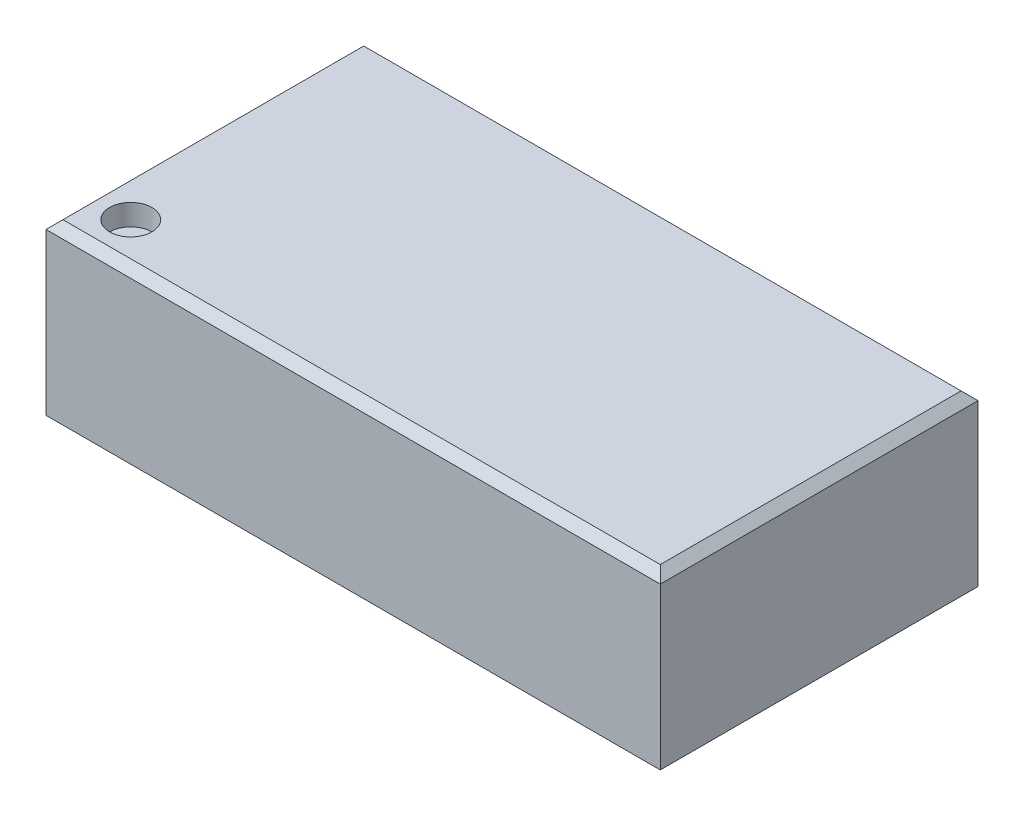
ISO-10303-21;
HEADER;
FILE_DESCRIPTION(('STEP AP214'),'2;1');
FILE_NAME('part.step','',(''),(''),'','','');
FILE_SCHEMA(('AUTOMOTIVE_DESIGN { 1 0 10303 214 1 1 1 1 }'));
ENDSEC;
DATA;
#1=APPLICATION_CONTEXT('core data for automotive mechanical design processes');
#2=APPLICATION_PROTOCOL_DEFINITION('international standard','automotive_design',2000,#1);
#3=PRODUCT_CONTEXT('',#1,'mechanical');
#4=PRODUCT('Part','Part','',(#3));
#5=PRODUCT_RELATED_PRODUCT_CATEGORY('part','',(#4));
#6=PRODUCT_DEFINITION_FORMATION('','',#4);
#7=PRODUCT_DEFINITION_CONTEXT('part definition',#1,'design');
#8=PRODUCT_DEFINITION('design','',#6,#7);
#9=PRODUCT_DEFINITION_SHAPE('','',#8);
#10=(LENGTH_UNIT() NAMED_UNIT(*) SI_UNIT(.MILLI.,.METRE.));
#11=(NAMED_UNIT(*) PLANE_ANGLE_UNIT() SI_UNIT($,.RADIAN.));
#12=(NAMED_UNIT(*) SI_UNIT($,.STERADIAN.) SOLID_ANGLE_UNIT());
#13=UNCERTAINTY_MEASURE_WITH_UNIT(LENGTH_MEASURE(1.E-05),#10,'distance_accuracy_value','');
#14=(GEOMETRIC_REPRESENTATION_CONTEXT(3) GLOBAL_UNCERTAINTY_ASSIGNED_CONTEXT((#13)) GLOBAL_UNIT_ASSIGNED_CONTEXT((#10,
#11,#12)) REPRESENTATION_CONTEXT('',''));
#15=CARTESIAN_POINT('',(0.,0.,0.));
#16=DIRECTION('',(0.,0.,1.));
#17=DIRECTION('',(1.,0.,0.));
#18=AXIS2_PLACEMENT_3D('',#15,#16,#17);
#19=CARTESIAN_POINT('',(-3.625,2.,-1.875));
#20=DIRECTION('',(1.,0.,0.));
#21=DIRECTION('',(0.,0.,-1.));
#22=AXIS2_PLACEMENT_3D('',#19,#20,#21);
#23=PLANE('',#22);
#24=DIRECTION('',(0.,-1.,0.));
#25=VECTOR('',#24,1.);
#26=CARTESIAN_POINT('',(-3.625,2.,1.875));
#27=LINE('',#26,#25);
#28=CARTESIAN_POINT('',(-3.625,1.9,1.875));
#29=VERTEX_POINT('',#28);
#30=CARTESIAN_POINT('',(-3.625,0.,1.875));
#31=VERTEX_POINT('',#30);
#32=EDGE_CURVE('E86',#29,#31,#27,.T.);
#33=ORIENTED_EDGE('',*,*,#32,.F.);
#34=DIRECTION('',(0.,0.,-1.));
#35=VECTOR('',#34,1.);
#36=CARTESIAN_POINT('',(-3.625,1.9,-1.875));
#37=LINE('',#36,#35);
#38=CARTESIAN_POINT('',(-3.625,1.9,-1.875));
#39=VERTEX_POINT('',#38);
#40=EDGE_CURVE('E11',#29,#39,#37,.T.);
#41=ORIENTED_EDGE('',*,*,#40,.T.);
#42=DIRECTION('',(0.,-1.,0.));
#43=VECTOR('',#42,1.);
#44=CARTESIAN_POINT('',(-3.625,2.,-1.875));
#45=LINE('',#44,#43);
#46=CARTESIAN_POINT('',(-3.625,0.,-1.875));
#47=VERTEX_POINT('',#46);
#48=EDGE_CURVE('E103',#39,#47,#45,.T.);
#49=ORIENTED_EDGE('',*,*,#48,.T.);
#50=DIRECTION('',(0.,0.,1.));
#51=VECTOR('',#50,1.);
#52=CARTESIAN_POINT('',(-3.625,0.,-1.875));
#53=LINE('',#52,#51);
#54=EDGE_CURVE('E99',#47,#31,#53,.T.);
#55=ORIENTED_EDGE('',*,*,#54,.T.);
#56=EDGE_LOOP('',(#33,#41,#49,#55));
#57=FACE_BOUND('',#56,.T.);
#58=ADVANCED_FACE('F34',(#57),#23,.F.);
#59=CARTESIAN_POINT('',(-3.625,2.,1.875));
#60=DIRECTION('',(0.,0.,-1.));
#61=DIRECTION('',(-1.,0.,0.));
#62=AXIS2_PLACEMENT_3D('',#59,#60,#61);
#63=PLANE('',#62);
#64=DIRECTION('',(0.,-1.,0.));
#65=VECTOR('',#64,1.);
#66=CARTESIAN_POINT('',(3.625,2.,1.875));
#67=LINE('',#66,#65);
#68=CARTESIAN_POINT('',(3.625,1.9,1.875));
#69=VERTEX_POINT('',#68);
#70=CARTESIAN_POINT('',(3.625,0.,1.875));
#71=VERTEX_POINT('',#70);
#72=EDGE_CURVE('E93',#69,#71,#67,.T.);
#73=ORIENTED_EDGE('',*,*,#72,.F.);
#74=DIRECTION('',(-1.,0.,0.));
#75=VECTOR('',#74,1.);
#76=CARTESIAN_POINT('',(-3.625,1.9,1.875));
#77=LINE('',#76,#75);
#78=EDGE_CURVE('E57',#69,#29,#77,.T.);
#79=ORIENTED_EDGE('',*,*,#78,.T.);
#80=ORIENTED_EDGE('',*,*,#32,.T.);
#81=DIRECTION('',(1.,0.,0.));
#82=VECTOR('',#81,1.);
#83=CARTESIAN_POINT('',(-3.625,0.,1.875));
#84=LINE('',#83,#82);
#85=EDGE_CURVE('E89',#31,#71,#84,.T.);
#86=ORIENTED_EDGE('',*,*,#85,.T.);
#87=EDGE_LOOP('',(#73,#79,#80,#86));
#88=FACE_BOUND('',#87,.T.);
#89=ADVANCED_FACE('F88',(#88),#63,.F.);
#90=CARTESIAN_POINT('',(3.625,2.,-1.875));
#91=DIRECTION('',(-1.,0.,0.));
#92=DIRECTION('',(0.,0.,1.));
#93=AXIS2_PLACEMENT_3D('',#90,#91,#92);
#94=PLANE('',#93);
#95=DIRECTION('',(0.,-1.,0.));
#96=VECTOR('',#95,1.);
#97=CARTESIAN_POINT('',(3.625,2.,-1.875));
#98=LINE('',#97,#96);
#99=CARTESIAN_POINT('',(3.625,1.9,-1.875));
#100=VERTEX_POINT('',#99);
#101=CARTESIAN_POINT('',(3.625,0.,-1.875));
#102=VERTEX_POINT('',#101);
#103=EDGE_CURVE('E116',#100,#102,#98,.T.);
#104=ORIENTED_EDGE('',*,*,#103,.F.);
#105=DIRECTION('',(0.,0.,1.));
#106=VECTOR('',#105,1.);
#107=CARTESIAN_POINT('',(3.625,1.9,1.875));
#108=LINE('',#107,#106);
#109=EDGE_CURVE('E127',#100,#69,#108,.T.);
#110=ORIENTED_EDGE('',*,*,#109,.T.);
#111=ORIENTED_EDGE('',*,*,#72,.T.);
#112=DIRECTION('',(0.,0.,-1.));
#113=VECTOR('',#112,1.);
#114=CARTESIAN_POINT('',(3.625,0.,-1.875));
#115=LINE('',#114,#113);
#116=EDGE_CURVE('E101',#71,#102,#115,.T.);
#117=ORIENTED_EDGE('',*,*,#116,.T.);
#118=EDGE_LOOP('',(#104,#110,#111,#117));
#119=FACE_BOUND('',#118,.T.);
#120=ADVANCED_FACE('F160',(#119),#94,.F.);
#121=CARTESIAN_POINT('',(-3.625,2.,-1.875));
#122=DIRECTION('',(0.,0.,1.));
#123=DIRECTION('',(1.,0.,0.));
#124=AXIS2_PLACEMENT_3D('',#121,#122,#123);
#125=PLANE('',#124);
#126=ORIENTED_EDGE('',*,*,#48,.F.);
#127=DIRECTION('',(1.,0.,0.));
#128=VECTOR('',#127,1.);
#129=CARTESIAN_POINT('',(3.625,1.9,-1.875));
#130=LINE('',#129,#128);
#131=EDGE_CURVE('E43',#39,#100,#130,.T.);
#132=ORIENTED_EDGE('',*,*,#131,.T.);
#133=ORIENTED_EDGE('',*,*,#103,.T.);
#134=DIRECTION('',(-1.,0.,0.));
#135=VECTOR('',#134,1.);
#136=CARTESIAN_POINT('',(-3.625,0.,-1.875));
#137=LINE('',#136,#135);
#138=EDGE_CURVE('E113',#102,#47,#137,.T.);
#139=ORIENTED_EDGE('',*,*,#138,.T.);
#140=EDGE_LOOP('',(#126,#132,#133,#139));
#141=FACE_BOUND('',#140,.T.);
#142=ADVANCED_FACE('F152',(#141),#125,.F.);
#143=CARTESIAN_POINT('',(0.,2.,0.));
#144=DIRECTION('',(0.,1.,0.));
#145=DIRECTION('',(0.,0.,1.));
#146=AXIS2_PLACEMENT_3D('',#143,#144,#145);
#147=PLANE('',#146);
#148=DIRECTION('',(1.,0.,0.));
#149=VECTOR('',#148,1.);
#150=CARTESIAN_POINT('',(3.625,2.,1.775));
#151=LINE('',#150,#149);
#152=CARTESIAN_POINT('',(-3.525,2.,1.775));
#153=VERTEX_POINT('',#152);
#154=CARTESIAN_POINT('',(3.525,2.,1.775));
#155=VERTEX_POINT('',#154);
#156=EDGE_CURVE('E122',#153,#155,#151,.T.);
#157=ORIENTED_EDGE('',*,*,#156,.T.);
#158=DIRECTION('',(0.,0.,-1.));
#159=VECTOR('',#158,1.);
#160=CARTESIAN_POINT('',(3.525,2.,-1.875));
#161=LINE('',#160,#159);
#162=CARTESIAN_POINT('',(3.525,2.,-1.775));
#163=VERTEX_POINT('',#162);
#164=EDGE_CURVE('E124',#155,#163,#161,.T.);
#165=ORIENTED_EDGE('',*,*,#164,.T.);
#166=DIRECTION('',(-1.,0.,0.));
#167=VECTOR('',#166,1.);
#168=CARTESIAN_POINT('',(-3.625,2.,-1.775));
#169=LINE('',#168,#167);
#170=CARTESIAN_POINT('',(-3.525,2.,-1.775));
#171=VERTEX_POINT('',#170);
#172=EDGE_CURVE('E120',#163,#171,#169,.T.);
#173=ORIENTED_EDGE('',*,*,#172,.T.);
#174=DIRECTION('',(0.,0.,1.));
#175=VECTOR('',#174,1.);
#176=CARTESIAN_POINT('',(-3.525,2.,1.875));
#177=LINE('',#176,#175);
#178=EDGE_CURVE('E92',#171,#153,#177,.T.);
#179=ORIENTED_EDGE('',*,*,#178,.T.);
#180=EDGE_LOOP('',(#157,#165,#173,#179));
#181=FACE_BOUND('',#180,.T.);
#182=CARTESIAN_POINT('',(-3.125,2.,1.375));
#183=DIRECTION('',(0.,1.,0.));
#184=DIRECTION('',(0.,0.,1.));
#185=AXIS2_PLACEMENT_3D('',#182,#183,#184);
#186=CIRCLE('',#185,0.25);
#187=CARTESIAN_POINT('',(-3.125,2.,1.625));
#188=VERTEX_POINT('',#187);
#189=EDGE_CURVE('E108',#188,#188,#186,.T.);
#190=ORIENTED_EDGE('',*,*,#189,.F.);
#191=EDGE_LOOP('',(#190));
#192=FACE_BOUND('',#191,.T.);
#193=ADVANCED_FACE('F150',(#181,#192),#147,.T.);
#194=CARTESIAN_POINT('',(0.,0.,0.));
#195=DIRECTION('',(0.,1.,0.));
#196=DIRECTION('',(0.,0.,1.));
#197=AXIS2_PLACEMENT_3D('',#194,#195,#196);
#198=PLANE('',#197);
#199=ORIENTED_EDGE('',*,*,#54,.F.);
#200=ORIENTED_EDGE('',*,*,#138,.F.);
#201=ORIENTED_EDGE('',*,*,#116,.F.);
#202=ORIENTED_EDGE('',*,*,#85,.F.);
#203=EDGE_LOOP('',(#199,#200,#201,#202));
#204=FACE_BOUND('',#203,.T.);
#205=ADVANCED_FACE('F97',(#204),#198,.F.);
#206=CARTESIAN_POINT('',(-3.125,1.75,1.375));
#207=DIRECTION('',(0.,1.,0.));
#208=DIRECTION('',(0.,0.,1.));
#209=AXIS2_PLACEMENT_3D('',#206,#207,#208);
#210=CYLINDRICAL_SURFACE('',#209,0.25);
#211=CARTESIAN_POINT('',(-3.125,1.75,1.375));
#212=DIRECTION('',(0.,1.,0.));
#213=DIRECTION('',(0.,0.,1.));
#214=AXIS2_PLACEMENT_3D('',#211,#212,#213);
#215=CIRCLE('',#214,0.25);
#216=CARTESIAN_POINT('',(-3.125,1.75,1.625));
#217=VERTEX_POINT('',#216);
#218=EDGE_CURVE('E105',#217,#217,#215,.T.);
#219=ORIENTED_EDGE('',*,*,#218,.F.);
#220=EDGE_LOOP('',(#219));
#221=FACE_BOUND('',#220,.T.);
#222=ORIENTED_EDGE('',*,*,#189,.T.);
#223=EDGE_LOOP('',(#222));
#224=FACE_BOUND('',#223,.T.);
#225=ADVANCED_FACE('F148',(#221,#224),#210,.F.);
#226=CARTESIAN_POINT('',(-3.125,1.75,1.375));
#227=DIRECTION('',(0.,1.,0.));
#228=DIRECTION('',(0.,0.,1.));
#229=AXIS2_PLACEMENT_3D('',#226,#227,#228);
#230=PLANE('',#229);
#231=ORIENTED_EDGE('',*,*,#218,.T.);
#232=EDGE_LOOP('',(#231));
#233=FACE_BOUND('',#232,.T.);
#234=ADVANCED_FACE('F183',(#233),#230,.T.);
#235=CARTESIAN_POINT('',(-3.525,2.,0.));
#236=DIRECTION('',(-0.707106781186548,0.707106781186548,0.));
#237=DIRECTION('',(0.,0.,-1.));
#238=AXIS2_PLACEMENT_3D('',#235,#236,#237);
#239=PLANE('',#238);
#240=DIRECTION('',(-0.577350269189626,-0.577350269189626,-0.577350269189626));
#241=VECTOR('',#240,1.);
#242=CARTESIAN_POINT('',(-2.93333333333333,2.59166666666667,-1.18333333333333));
#243=LINE('',#242,#241);
#244=EDGE_CURVE('E135',#39,#171,#243,.F.);
#245=ORIENTED_EDGE('',*,*,#244,.F.);
#246=ORIENTED_EDGE('',*,*,#40,.F.);
#247=DIRECTION('',(0.577350269189626,0.577350269189626,-0.577350269189626));
#248=VECTOR('',#247,1.);
#249=CARTESIAN_POINT('',(-2.93333333333333,2.59166666666667,1.18333333333333));
#250=LINE('',#249,#248);
#251=EDGE_CURVE('E38',#153,#29,#250,.F.);
#252=ORIENTED_EDGE('',*,*,#251,.F.);
#253=ORIENTED_EDGE('',*,*,#178,.F.);
#254=EDGE_LOOP('',(#245,#246,#252,#253));
#255=FACE_BOUND('',#254,.T.);
#256=ADVANCED_FACE('F36',(#255),#239,.T.);
#257=CARTESIAN_POINT('',(0.,2.,1.775));
#258=DIRECTION('',(0.,0.707106781186548,0.707106781186548));
#259=DIRECTION('',(-1.,0.,0.));
#260=AXIS2_PLACEMENT_3D('',#257,#258,#259);
#261=PLANE('',#260);
#262=ORIENTED_EDGE('',*,*,#251,.T.);
#263=ORIENTED_EDGE('',*,*,#78,.F.);
#264=DIRECTION('',(-0.577350269189626,0.577350269189626,-0.577350269189626));
#265=VECTOR('',#264,1.);
#266=CARTESIAN_POINT('',(2.35,3.175,0.599999999999997));
#267=LINE('',#266,#265);
#268=EDGE_CURVE('E134',#155,#69,#267,.F.);
#269=ORIENTED_EDGE('',*,*,#268,.F.);
#270=ORIENTED_EDGE('',*,*,#156,.F.);
#271=EDGE_LOOP('',(#262,#263,#269,#270));
#272=FACE_BOUND('',#271,.T.);
#273=ADVANCED_FACE('F178',(#272),#261,.T.);
#274=CARTESIAN_POINT('',(0.,2.,-1.775));
#275=DIRECTION('',(0.,0.707106781186548,-0.707106781186548));
#276=DIRECTION('',(1.,0.,0.));
#277=AXIS2_PLACEMENT_3D('',#274,#275,#276);
#278=PLANE('',#277);
#279=ORIENTED_EDGE('',*,*,#244,.T.);
#280=ORIENTED_EDGE('',*,*,#172,.F.);
#281=DIRECTION('',(0.577350269189626,-0.577350269189626,-0.577350269189626));
#282=VECTOR('',#281,1.);
#283=CARTESIAN_POINT('',(2.35,3.175,-0.599999999999999));
#284=LINE('',#283,#282);
#285=EDGE_CURVE('E132',#100,#163,#284,.F.);
#286=ORIENTED_EDGE('',*,*,#285,.F.);
#287=ORIENTED_EDGE('',*,*,#131,.F.);
#288=EDGE_LOOP('',(#279,#280,#286,#287));
#289=FACE_BOUND('',#288,.T.);
#290=ADVANCED_FACE('F175',(#289),#278,.T.);
#291=CARTESIAN_POINT('',(3.525,2.,0.));
#292=DIRECTION('',(0.707106781186548,0.707106781186548,0.));
#293=DIRECTION('',(0.,0.,1.));
#294=AXIS2_PLACEMENT_3D('',#291,#292,#293);
#295=PLANE('',#294);
#296=ORIENTED_EDGE('',*,*,#268,.T.);
#297=ORIENTED_EDGE('',*,*,#109,.F.);
#298=ORIENTED_EDGE('',*,*,#285,.T.);
#299=ORIENTED_EDGE('',*,*,#164,.F.);
#300=EDGE_LOOP('',(#296,#297,#298,#299));
#301=FACE_BOUND('',#300,.T.);
#302=ADVANCED_FACE('F172',(#301),#295,.T.);
#303=CLOSED_SHELL('',(#58,#89,#120,#142,#193,#205,#225,#234,#256,#273,#290,#302));
#304=MANIFOLD_SOLID_BREP('B2',#303);
#305=ADVANCED_BREP_SHAPE_REPRESENTATION('',(#18,#304),#14);
#306=SHAPE_DEFINITION_REPRESENTATION(#9,#305);
ENDSEC;
END-ISO-10303-21;
